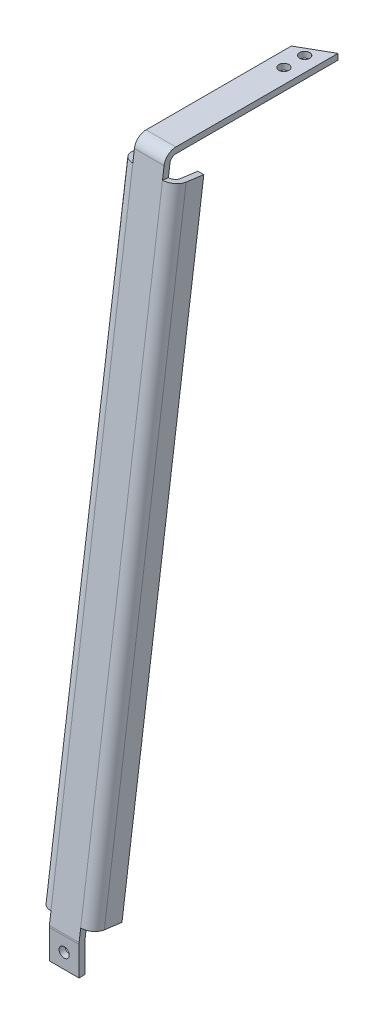
ISO-10303-21;
HEADER;
FILE_DESCRIPTION(('STEP AP214'),'2;1');
FILE_NAME('part.step','',(''),(''),'','','');
FILE_SCHEMA(('AUTOMOTIVE_DESIGN { 1 0 10303 214 1 1 1 1 }'));
ENDSEC;
DATA;
#1=APPLICATION_CONTEXT('core data for automotive mechanical design processes');
#2=APPLICATION_PROTOCOL_DEFINITION('international standard','automotive_design',2000,#1);
#3=PRODUCT_CONTEXT('',#1,'mechanical');
#4=PRODUCT('Part','Part','',(#3));
#5=PRODUCT_RELATED_PRODUCT_CATEGORY('part','',(#4));
#6=PRODUCT_DEFINITION_FORMATION('','',#4);
#7=PRODUCT_DEFINITION_CONTEXT('part definition',#1,'design');
#8=PRODUCT_DEFINITION('design','',#6,#7);
#9=PRODUCT_DEFINITION_SHAPE('','',#8);
#10=(LENGTH_UNIT() NAMED_UNIT(*) SI_UNIT(.MILLI.,.METRE.));
#11=(NAMED_UNIT(*) PLANE_ANGLE_UNIT() SI_UNIT($,.RADIAN.));
#12=(NAMED_UNIT(*) SI_UNIT($,.STERADIAN.) SOLID_ANGLE_UNIT());
#13=UNCERTAINTY_MEASURE_WITH_UNIT(LENGTH_MEASURE(1.E-05),#10,'distance_accuracy_value','');
#14=(GEOMETRIC_REPRESENTATION_CONTEXT(3) GLOBAL_UNCERTAINTY_ASSIGNED_CONTEXT((#13)) GLOBAL_UNIT_ASSIGNED_CONTEXT((#10,
#11,#12)) REPRESENTATION_CONTEXT('',''));
#15=CARTESIAN_POINT('',(0.,0.,0.));
#16=DIRECTION('',(0.,0.,1.));
#17=DIRECTION('',(1.,0.,0.));
#18=AXIS2_PLACEMENT_3D('',#15,#16,#17);
#19=CARTESIAN_POINT('',(-250.,-68.,77.3774837469467));
#20=DIRECTION('',(1.,0.,0.));
#21=DIRECTION('',(0.,0.,-1.));
#22=AXIS2_PLACEMENT_3D('',#19,#20,#21);
#23=PLANE('',#22);
#24=DIRECTION('',(0.,0.,-1.));
#25=VECTOR('',#24,1.);
#26=CARTESIAN_POINT('',(-250.,-66.,77.3774837469467));
#27=LINE('',#26,#25);
#28=CARTESIAN_POINT('',(-250.,-66.,77.3774837469467));
#29=VERTEX_POINT('',#28);
#30=CARTESIAN_POINT('',(-250.,-66.,22.8));
#31=VERTEX_POINT('',#30);
#32=EDGE_CURVE('E227',#29,#31,#27,.T.);
#33=ORIENTED_EDGE('',*,*,#32,.T.);
#34=DIRECTION('',(0.,1.,0.));
#35=VECTOR('',#34,1.);
#36=CARTESIAN_POINT('',(-250.,-68.,22.8));
#37=LINE('',#36,#35);
#38=CARTESIAN_POINT('',(-250.,-64.,22.8));
#39=VERTEX_POINT('',#38);
#40=EDGE_CURVE('E54',#31,#39,#37,.T.);
#41=ORIENTED_EDGE('',*,*,#40,.T.);
#42=DIRECTION('',(0.,0.,1.));
#43=VECTOR('',#42,1.);
#44=CARTESIAN_POINT('',(-250.,-64.,22.));
#45=LINE('',#44,#43);
#46=CARTESIAN_POINT('',(-250.,-64.,77.3774837469467));
#47=VERTEX_POINT('',#46);
#48=EDGE_CURVE('E218',#39,#47,#45,.T.);
#49=ORIENTED_EDGE('',*,*,#48,.T.);
#50=CARTESIAN_POINT('',(-250.,-68.,77.3774837469467));
#51=DIRECTION('',(1.,0.,0.));
#52=DIRECTION('',(0.,0.,-1.));
#53=AXIS2_PLACEMENT_3D('',#50,#51,#52);
#54=CIRCLE('',#53,4.00000000000001);
#55=CARTESIAN_POINT('',(-250.,-67.4653071902495,81.3415856123383));
#56=VERTEX_POINT('',#55);
#57=EDGE_CURVE('E225',#47,#56,#54,.T.);
#58=ORIENTED_EDGE('',*,*,#57,.T.);
#59=DIRECTION('',(0.,-0.991025466347899,0.133673202437623));
#60=VECTOR('',#59,1.);
#61=CARTESIAN_POINT('',(-250.,-67.4653071902495,81.3415856123383));
#62=LINE('',#61,#60);
#63=CARTESIAN_POINT('',(-250.,-71.4294090556411,81.8762784220888));
#64=VERTEX_POINT('',#63);
#65=EDGE_CURVE('E366',#56,#64,#62,.T.);
#66=ORIENTED_EDGE('',*,*,#65,.T.);
#67=DIRECTION('',(0.,-0.133673202437623,-0.991025466347899));
#68=VECTOR('',#67,1.);
#69=CARTESIAN_POINT('',(-250.,-71.9641018653916,77.9121765566972));
#70=LINE('',#69,#68);
#71=CARTESIAN_POINT('',(-250.,-71.6967554605163,79.894227489393));
#72=VERTEX_POINT('',#71);
#73=EDGE_CURVE('E265',#64,#72,#70,.T.);
#74=ORIENTED_EDGE('',*,*,#73,.T.);
#75=DIRECTION('',(0.,0.991025466347899,-0.133673202437624));
#76=VECTOR('',#75,1.);
#77=CARTESIAN_POINT('',(-250.,-279.934067195348,107.982050932696));
#78=LINE('',#77,#76);
#79=CARTESIAN_POINT('',(-250.,-67.7326535951247,79.3595346796425));
#80=VERTEX_POINT('',#79);
#81=EDGE_CURVE('E381',#72,#80,#78,.T.);
#82=ORIENTED_EDGE('',*,*,#81,.T.);
#83=CARTESIAN_POINT('',(-250.,-68.,77.3774837469467));
#84=DIRECTION('',(-1.,0.,0.));
#85=DIRECTION('',(0.,0.,-1.));
#86=AXIS2_PLACEMENT_3D('',#83,#84,#85);
#87=CIRCLE('',#86,2.);
#88=EDGE_CURVE('E384',#80,#29,#87,.T.);
#89=ORIENTED_EDGE('',*,*,#88,.T.);
#90=EDGE_LOOP('',(#33,#41,#49,#58,#66,#74,#82,#89));
#91=FACE_BOUND('',#90,.T.);
#92=ADVANCED_FACE('F41',(#91),#23,.T.);
#93=CARTESIAN_POINT('',(-260.,-68.,77.3774837469467));
#94=DIRECTION('',(1.,0.,0.));
#95=DIRECTION('',(0.,0.,-1.));
#96=AXIS2_PLACEMENT_3D('',#93,#94,#95);
#97=PLANE('',#96);
#98=DIRECTION('',(0.,1.,0.));
#99=VECTOR('',#98,1.);
#100=CARTESIAN_POINT('',(-260.,-68.,28.5));
#101=LINE('',#100,#99);
#102=CARTESIAN_POINT('',(-260.,-66.,28.5));
#103=VERTEX_POINT('',#102);
#104=CARTESIAN_POINT('',(-260.,-64.,28.5));
#105=VERTEX_POINT('',#104);
#106=EDGE_CURVE('E199',#103,#105,#101,.T.);
#107=ORIENTED_EDGE('',*,*,#106,.F.);
#108=DIRECTION('',(0.,0.,-1.));
#109=VECTOR('',#108,1.);
#110=CARTESIAN_POINT('',(-260.,-66.,77.3774837469467));
#111=LINE('',#110,#109);
#112=CARTESIAN_POINT('',(-260.,-66.,77.3774837469467));
#113=VERTEX_POINT('',#112);
#114=EDGE_CURVE('E211',#113,#103,#111,.T.);
#115=ORIENTED_EDGE('',*,*,#114,.F.);
#116=CARTESIAN_POINT('',(-260.,-68.,77.3774837469467));
#117=DIRECTION('',(-1.,0.,0.));
#118=DIRECTION('',(0.,0.,-1.));
#119=AXIS2_PLACEMENT_3D('',#116,#117,#118);
#120=CIRCLE('',#119,2.);
#121=CARTESIAN_POINT('',(-260.,-67.7326535951247,79.3595346796425));
#122=VERTEX_POINT('',#121);
#123=EDGE_CURVE('E219',#122,#113,#120,.T.);
#124=ORIENTED_EDGE('',*,*,#123,.F.);
#125=DIRECTION('',(0.,0.991025466347899,-0.133673202437624));
#126=VECTOR('',#125,1.);
#127=CARTESIAN_POINT('',(-260.,-279.934067195348,107.982050932696));
#128=LINE('',#127,#126);
#129=CARTESIAN_POINT('',(-260.,-71.6967554605164,79.894227489393));
#130=VERTEX_POINT('',#129);
#131=EDGE_CURVE('E404',#130,#122,#128,.T.);
#132=ORIENTED_EDGE('',*,*,#131,.F.);
#133=DIRECTION('',(0.,-0.133673202437623,-0.991025466347899));
#134=VECTOR('',#133,1.);
#135=CARTESIAN_POINT('',(-260.,-71.9641018653916,77.9121765566972));
#136=LINE('',#135,#134);
#137=CARTESIAN_POINT('',(-260.,-71.4294090556411,81.8762784220888));
#138=VERTEX_POINT('',#137);
#139=EDGE_CURVE('E260',#138,#130,#136,.T.);
#140=ORIENTED_EDGE('',*,*,#139,.F.);
#141=DIRECTION('',(0.,-0.991025466347899,0.133673202437623));
#142=VECTOR('',#141,1.);
#143=CARTESIAN_POINT('',(-260.,-67.4653071902495,81.3415856123383));
#144=LINE('',#143,#142);
#145=CARTESIAN_POINT('',(-260.,-67.4653071902495,81.3415856123383));
#146=VERTEX_POINT('',#145);
#147=EDGE_CURVE('E395',#146,#138,#144,.T.);
#148=ORIENTED_EDGE('',*,*,#147,.F.);
#149=CARTESIAN_POINT('',(-260.,-68.,77.3774837469467));
#150=DIRECTION('',(1.,0.,0.));
#151=DIRECTION('',(0.,0.,-1.));
#152=AXIS2_PLACEMENT_3D('',#149,#150,#151);
#153=CIRCLE('',#152,4.00000000000001);
#154=CARTESIAN_POINT('',(-260.,-64.,77.3774837469467));
#155=VERTEX_POINT('',#154);
#156=EDGE_CURVE('E386',#155,#146,#153,.T.);
#157=ORIENTED_EDGE('',*,*,#156,.F.);
#158=DIRECTION('',(0.,0.,1.));
#159=VECTOR('',#158,1.);
#160=CARTESIAN_POINT('',(-260.,-64.,22.));
#161=LINE('',#160,#159);
#162=EDGE_CURVE('E213',#105,#155,#161,.T.);
#163=ORIENTED_EDGE('',*,*,#162,.F.);
#164=EDGE_LOOP('',(#107,#115,#124,#132,#140,#148,#157,#163));
#165=FACE_BOUND('',#164,.T.);
#166=ADVANCED_FACE('F207',(#165),#97,.F.);
#167=CARTESIAN_POINT('',(-250.,-64.,22.));
#168=DIRECTION('',(0.,-1.,0.));
#169=DIRECTION('',(0.,0.,-1.));
#170=AXIS2_PLACEMENT_3D('',#167,#168,#169);
#171=PLANE('',#170);
#172=CARTESIAN_POINT('',(-255.,-64.,36.));
#173=DIRECTION('',(0.,-1.,0.));
#174=DIRECTION('',(0.,0.,-1.));
#175=AXIS2_PLACEMENT_3D('',#172,#173,#174);
#176=CIRCLE('',#175,1.69999999999998);
#177=CARTESIAN_POINT('',(-255.,-64.,34.3));
#178=VERTEX_POINT('',#177);
#179=EDGE_CURVE('E267',#178,#178,#176,.F.);
#180=ORIENTED_EDGE('',*,*,#179,.F.);
#181=EDGE_LOOP('',(#180));
#182=FACE_BOUND('',#181,.T.);
#183=CARTESIAN_POINT('',(-255.,-64.,29.));
#184=DIRECTION('',(0.,-1.,0.));
#185=DIRECTION('',(0.,0.,-1.));
#186=AXIS2_PLACEMENT_3D('',#183,#184,#185);
#187=CIRCLE('',#186,1.69999999999998);
#188=CARTESIAN_POINT('',(-255.,-64.,27.3));
#189=VERTEX_POINT('',#188);
#190=EDGE_CURVE('E272',#189,#189,#187,.F.);
#191=ORIENTED_EDGE('',*,*,#190,.F.);
#192=EDGE_LOOP('',(#191));
#193=FACE_BOUND('',#192,.T.);
#194=DIRECTION('',(0.868777270192661,0.,-0.495203044009816));
#195=VECTOR('',#194,1.);
#196=CARTESIAN_POINT('',(-249.655823080987,-64.,22.6038191561627));
#197=LINE('',#196,#195);
#198=EDGE_CURVE('E277',#105,#39,#197,.T.);
#199=ORIENTED_EDGE('',*,*,#198,.F.);
#200=ORIENTED_EDGE('',*,*,#162,.T.);
#201=DIRECTION('',(-1.,0.,0.));
#202=VECTOR('',#201,1.);
#203=CARTESIAN_POINT('',(-250.,-64.,77.3774837469467));
#204=LINE('',#203,#202);
#205=EDGE_CURVE('E255',#47,#155,#204,.T.);
#206=ORIENTED_EDGE('',*,*,#205,.F.);
#207=ORIENTED_EDGE('',*,*,#48,.F.);
#208=EDGE_LOOP('',(#199,#200,#206,#207));
#209=FACE_BOUND('',#208,.T.);
#210=ADVANCED_FACE('F43',(#182,#193,#209),#171,.F.);
#211=CARTESIAN_POINT('',(-250.,-66.,77.3774837469467));
#212=DIRECTION('',(0.,1.,0.));
#213=DIRECTION('',(0.,0.,1.));
#214=AXIS2_PLACEMENT_3D('',#211,#212,#213);
#215=PLANE('',#214);
#216=CARTESIAN_POINT('',(-255.,-66.,36.));
#217=DIRECTION('',(0.,1.,0.));
#218=DIRECTION('',(0.,0.,1.));
#219=AXIS2_PLACEMENT_3D('',#216,#217,#218);
#220=CIRCLE('',#219,1.69999999999998);
#221=CARTESIAN_POINT('',(-255.,-66.,37.7));
#222=VERTEX_POINT('',#221);
#223=EDGE_CURVE('E266',#222,#222,#220,.F.);
#224=ORIENTED_EDGE('',*,*,#223,.F.);
#225=EDGE_LOOP('',(#224));
#226=FACE_BOUND('',#225,.T.);
#227=CARTESIAN_POINT('',(-255.,-66.,29.));
#228=DIRECTION('',(0.,1.,0.));
#229=DIRECTION('',(0.,0.,1.));
#230=AXIS2_PLACEMENT_3D('',#227,#228,#229);
#231=CIRCLE('',#230,1.69999999999998);
#232=CARTESIAN_POINT('',(-255.,-66.,30.7));
#233=VERTEX_POINT('',#232);
#234=EDGE_CURVE('E271',#233,#233,#231,.F.);
#235=ORIENTED_EDGE('',*,*,#234,.F.);
#236=EDGE_LOOP('',(#235));
#237=FACE_BOUND('',#236,.T.);
#238=DIRECTION('',(-0.868777270192661,0.,0.495203044009816));
#239=VECTOR('',#238,1.);
#240=CARTESIAN_POINT('',(-273.480387754366,-66.,36.1838210199886));
#241=LINE('',#240,#239);
#242=EDGE_CURVE('E11',#31,#103,#241,.T.);
#243=ORIENTED_EDGE('',*,*,#242,.F.);
#244=ORIENTED_EDGE('',*,*,#32,.F.);
#245=DIRECTION('',(-1.,0.,0.));
#246=VECTOR('',#245,1.);
#247=CARTESIAN_POINT('',(-250.,-66.,77.3774837469467));
#248=LINE('',#247,#246);
#249=EDGE_CURVE('E217',#29,#113,#248,.T.);
#250=ORIENTED_EDGE('',*,*,#249,.T.);
#251=ORIENTED_EDGE('',*,*,#114,.T.);
#252=EDGE_LOOP('',(#243,#244,#250,#251));
#253=FACE_BOUND('',#252,.T.);
#254=ADVANCED_FACE('F216',(#226,#237,#253),#215,.F.);
#255=CARTESIAN_POINT('',(-250.,-68.,77.3774837469467));
#256=DIRECTION('',(-1.,0.,0.));
#257=DIRECTION('',(0.,0.,1.));
#258=AXIS2_PLACEMENT_3D('',#255,#256,#257);
#259=CYLINDRICAL_SURFACE('',#258,4.00000000000001);
#260=ORIENTED_EDGE('',*,*,#156,.T.);
#261=DIRECTION('',(-1.,0.,0.));
#262=VECTOR('',#261,1.);
#263=CARTESIAN_POINT('',(-250.,-67.4653071902495,81.3415856123383));
#264=LINE('',#263,#262);
#265=EDGE_CURVE('E253',#56,#146,#264,.T.);
#266=ORIENTED_EDGE('',*,*,#265,.F.);
#267=ORIENTED_EDGE('',*,*,#57,.F.);
#268=ORIENTED_EDGE('',*,*,#205,.T.);
#269=EDGE_LOOP('',(#260,#266,#267,#268));
#270=FACE_BOUND('',#269,.T.);
#271=ADVANCED_FACE('F473',(#270),#259,.T.);
#272=CARTESIAN_POINT('',(-250.,-67.4653071902495,81.3415856123383));
#273=DIRECTION('',(0.,-0.133673202437623,-0.991025466347899));
#274=DIRECTION('',(0.,0.991025466347899,-0.133673202437623));
#275=AXIS2_PLACEMENT_3D('',#272,#273,#274);
#276=PLANE('',#275);
#277=ORIENTED_EDGE('',*,*,#147,.T.);
#278=DIRECTION('',(0.,0.991025466347899,-0.133673202437623));
#279=VECTOR('',#278,1.);
#280=CARTESIAN_POINT('',(-260.,-275.702618925081,109.429409055641));
#281=LINE('',#280,#279);
#282=CARTESIAN_POINT('',(-260.,-275.702618925081,109.429409055641));
#283=VERTEX_POINT('',#282);
#284=EDGE_CURVE('E304',#283,#138,#281,.T.);
#285=ORIENTED_EDGE('',*,*,#284,.F.);
#286=CARTESIAN_POINT('',(-260.,-279.666720790473,109.964101865392));
#287=VERTEX_POINT('',#286);
#288=EDGE_CURVE('E393',#283,#287,#144,.T.);
#289=ORIENTED_EDGE('',*,*,#288,.T.);
#290=DIRECTION('',(-1.,0.,0.));
#291=VECTOR('',#290,1.);
#292=CARTESIAN_POINT('',(-250.,-279.666720790473,109.964101865392));
#293=LINE('',#292,#291);
#294=CARTESIAN_POINT('',(-250.,-279.666720790473,109.964101865392));
#295=VERTEX_POINT('',#294);
#296=EDGE_CURVE('E250',#295,#287,#293,.T.);
#297=ORIENTED_EDGE('',*,*,#296,.F.);
#298=CARTESIAN_POINT('',(-250.,-275.702618925081,109.429409055641));
#299=VERTEX_POINT('',#298);
#300=EDGE_CURVE('E370',#299,#295,#62,.T.);
#301=ORIENTED_EDGE('',*,*,#300,.F.);
#302=DIRECTION('',(0.,0.991025466347899,-0.133673202437623));
#303=VECTOR('',#302,1.);
#304=CARTESIAN_POINT('',(-250.,-275.702618925081,109.429409055641));
#305=LINE('',#304,#303);
#306=EDGE_CURVE('E290',#299,#64,#305,.T.);
#307=ORIENTED_EDGE('',*,*,#306,.T.);
#308=ORIENTED_EDGE('',*,*,#65,.F.);
#309=ORIENTED_EDGE('',*,*,#265,.T.);
#310=EDGE_LOOP('',(#277,#285,#289,#297,#301,#307,#308,#309));
#311=FACE_BOUND('',#310,.T.);
#312=ADVANCED_FACE('F467',(#311),#276,.F.);
#313=CARTESIAN_POINT('',(-250.,-280.201413600223,106.));
#314=DIRECTION('',(-1.,0.,0.));
#315=DIRECTION('',(0.,0.,1.));
#316=AXIS2_PLACEMENT_3D('',#313,#314,#315);
#317=CYLINDRICAL_SURFACE('',#316,3.99999999999999);
#318=CARTESIAN_POINT('',(-260.,-280.201413600223,106.));
#319=DIRECTION('',(1.,0.,0.));
#320=DIRECTION('',(0.,0.,-1.));
#321=AXIS2_PLACEMENT_3D('',#318,#319,#320);
#322=CIRCLE('',#321,3.99999999999999);
#323=CARTESIAN_POINT('',(-260.,-280.201413600223,110.));
#324=VERTEX_POINT('',#323);
#325=EDGE_CURVE('E392',#287,#324,#322,.T.);
#326=ORIENTED_EDGE('',*,*,#325,.T.);
#327=DIRECTION('',(-1.,0.,0.));
#328=VECTOR('',#327,1.);
#329=CARTESIAN_POINT('',(-250.,-280.201413600223,110.));
#330=LINE('',#329,#328);
#331=CARTESIAN_POINT('',(-250.,-280.201413600223,110.));
#332=VERTEX_POINT('',#331);
#333=EDGE_CURVE('E242',#332,#324,#330,.T.);
#334=ORIENTED_EDGE('',*,*,#333,.F.);
#335=CARTESIAN_POINT('',(-250.,-280.201413600223,106.));
#336=DIRECTION('',(1.,0.,0.));
#337=DIRECTION('',(0.,0.,-1.));
#338=AXIS2_PLACEMENT_3D('',#335,#336,#337);
#339=CIRCLE('',#338,3.99999999999999);
#340=EDGE_CURVE('E371',#295,#332,#339,.T.);
#341=ORIENTED_EDGE('',*,*,#340,.F.);
#342=ORIENTED_EDGE('',*,*,#296,.T.);
#343=EDGE_LOOP('',(#326,#334,#341,#342));
#344=FACE_BOUND('',#343,.T.);
#345=ADVANCED_FACE('F520',(#344),#317,.T.);
#346=CARTESIAN_POINT('',(-250.,-280.201413600223,110.));
#347=DIRECTION('',(0.,0.,-1.));
#348=DIRECTION('',(0.,1.,0.));
#349=AXIS2_PLACEMENT_3D('',#346,#347,#348);
#350=PLANE('',#349);
#351=CARTESIAN_POINT('',(-255.,-285.,110.));
#352=DIRECTION('',(0.,0.,-1.));
#353=DIRECTION('',(0.,1.,0.));
#354=AXIS2_PLACEMENT_3D('',#351,#352,#353);
#355=CIRCLE('',#354,1.69999999999998);
#356=CARTESIAN_POINT('',(-255.,-283.3,110.));
#357=VERTEX_POINT('',#356);
#358=EDGE_CURVE('E269',#357,#357,#355,.F.);
#359=ORIENTED_EDGE('',*,*,#358,.F.);
#360=EDGE_LOOP('',(#359));
#361=FACE_BOUND('',#360,.T.);
#362=DIRECTION('',(0.,-1.,0.));
#363=VECTOR('',#362,1.);
#364=CARTESIAN_POINT('',(-260.,-280.201413600223,110.));
#365=LINE('',#364,#363);
#366=CARTESIAN_POINT('',(-260.,-290.,110.));
#367=VERTEX_POINT('',#366);
#368=EDGE_CURVE('E399',#324,#367,#365,.T.);
#369=ORIENTED_EDGE('',*,*,#368,.T.);
#370=DIRECTION('',(-1.,0.,0.));
#371=VECTOR('',#370,1.);
#372=CARTESIAN_POINT('',(-250.,-290.,110.));
#373=LINE('',#372,#371);
#374=CARTESIAN_POINT('',(-250.,-290.,110.));
#375=VERTEX_POINT('',#374);
#376=EDGE_CURVE('E245',#375,#367,#373,.T.);
#377=ORIENTED_EDGE('',*,*,#376,.F.);
#378=DIRECTION('',(0.,-1.,0.));
#379=VECTOR('',#378,1.);
#380=CARTESIAN_POINT('',(-250.,-280.201413600223,110.));
#381=LINE('',#380,#379);
#382=EDGE_CURVE('E373',#332,#375,#381,.T.);
#383=ORIENTED_EDGE('',*,*,#382,.F.);
#384=ORIENTED_EDGE('',*,*,#333,.T.);
#385=EDGE_LOOP('',(#369,#377,#383,#384));
#386=FACE_BOUND('',#385,.T.);
#387=ADVANCED_FACE('F511',(#361,#386),#350,.F.);
#388=CARTESIAN_POINT('',(-250.,-290.,110.));
#389=DIRECTION('',(0.,1.,0.));
#390=DIRECTION('',(0.,0.,1.));
#391=AXIS2_PLACEMENT_3D('',#388,#389,#390);
#392=PLANE('',#391);
#393=DIRECTION('',(0.,0.,-1.));
#394=VECTOR('',#393,1.);
#395=CARTESIAN_POINT('',(-260.,-290.,110.));
#396=LINE('',#395,#394);
#397=CARTESIAN_POINT('',(-260.,-290.,108.));
#398=VERTEX_POINT('',#397);
#399=EDGE_CURVE('E396',#367,#398,#396,.T.);
#400=ORIENTED_EDGE('',*,*,#399,.T.);
#401=DIRECTION('',(-1.,0.,0.));
#402=VECTOR('',#401,1.);
#403=CARTESIAN_POINT('',(-250.,-290.,108.));
#404=LINE('',#403,#402);
#405=CARTESIAN_POINT('',(-250.,-290.,108.));
#406=VERTEX_POINT('',#405);
#407=EDGE_CURVE('E239',#406,#398,#404,.T.);
#408=ORIENTED_EDGE('',*,*,#407,.F.);
#409=DIRECTION('',(0.,0.,-1.));
#410=VECTOR('',#409,1.);
#411=CARTESIAN_POINT('',(-250.,-290.,110.));
#412=LINE('',#411,#410);
#413=EDGE_CURVE('E374',#375,#406,#412,.T.);
#414=ORIENTED_EDGE('',*,*,#413,.F.);
#415=ORIENTED_EDGE('',*,*,#376,.T.);
#416=EDGE_LOOP('',(#400,#408,#414,#415));
#417=FACE_BOUND('',#416,.T.);
#418=ADVANCED_FACE('F506',(#417),#392,.F.);
#419=CARTESIAN_POINT('',(-250.,-290.,108.));
#420=DIRECTION('',(0.,0.,1.));
#421=DIRECTION('',(1.,0.,0.));
#422=AXIS2_PLACEMENT_3D('',#419,#420,#421);
#423=PLANE('',#422);
#424=CARTESIAN_POINT('',(-255.,-285.,108.));
#425=DIRECTION('',(0.,0.,1.));
#426=DIRECTION('',(1.,0.,0.));
#427=AXIS2_PLACEMENT_3D('',#424,#425,#426);
#428=CIRCLE('',#427,1.69999999999998);
#429=CARTESIAN_POINT('',(-253.3,-285.,108.));
#430=VERTEX_POINT('',#429);
#431=EDGE_CURVE('E273',#430,#430,#428,.F.);
#432=ORIENTED_EDGE('',*,*,#431,.F.);
#433=EDGE_LOOP('',(#432));
#434=FACE_BOUND('',#433,.T.);
#435=DIRECTION('',(0.,1.,0.));
#436=VECTOR('',#435,1.);
#437=CARTESIAN_POINT('',(-260.,-290.,108.));
#438=LINE('',#437,#436);
#439=CARTESIAN_POINT('',(-260.,-280.201413600223,108.));
#440=VERTEX_POINT('',#439);
#441=EDGE_CURVE('E402',#398,#440,#438,.T.);
#442=ORIENTED_EDGE('',*,*,#441,.T.);
#443=DIRECTION('',(-1.,0.,0.));
#444=VECTOR('',#443,1.);
#445=CARTESIAN_POINT('',(-250.,-280.201413600223,108.));
#446=LINE('',#445,#444);
#447=CARTESIAN_POINT('',(-250.,-280.201413600223,108.));
#448=VERTEX_POINT('',#447);
#449=EDGE_CURVE('E237',#448,#440,#446,.T.);
#450=ORIENTED_EDGE('',*,*,#449,.F.);
#451=DIRECTION('',(0.,1.,0.));
#452=VECTOR('',#451,1.);
#453=CARTESIAN_POINT('',(-250.,-290.,108.));
#454=LINE('',#453,#452);
#455=EDGE_CURVE('E380',#406,#448,#454,.T.);
#456=ORIENTED_EDGE('',*,*,#455,.F.);
#457=ORIENTED_EDGE('',*,*,#407,.T.);
#458=EDGE_LOOP('',(#442,#450,#456,#457));
#459=FACE_BOUND('',#458,.T.);
#460=ADVANCED_FACE('F507',(#434,#459),#423,.F.);
#461=CARTESIAN_POINT('',(-250.,-280.201413600223,106.));
#462=DIRECTION('',(-1.,0.,0.));
#463=DIRECTION('',(0.,0.,1.));
#464=AXIS2_PLACEMENT_3D('',#461,#462,#463);
#465=CYLINDRICAL_SURFACE('',#464,2.00000000000001);
#466=CARTESIAN_POINT('',(-260.,-280.201413600223,106.));
#467=DIRECTION('',(-1.,0.,0.));
#468=DIRECTION('',(0.,0.,-1.));
#469=AXIS2_PLACEMENT_3D('',#466,#467,#468);
#470=CIRCLE('',#469,2.00000000000001);
#471=CARTESIAN_POINT('',(-260.,-279.934067195348,107.982050932696));
#472=VERTEX_POINT('',#471);
#473=EDGE_CURVE('E401',#440,#472,#470,.T.);
#474=ORIENTED_EDGE('',*,*,#473,.T.);
#475=DIRECTION('',(-1.,0.,0.));
#476=VECTOR('',#475,1.);
#477=CARTESIAN_POINT('',(-250.,-279.934067195348,107.982050932696));
#478=LINE('',#477,#476);
#479=CARTESIAN_POINT('',(-250.,-279.934067195348,107.982050932696));
#480=VERTEX_POINT('',#479);
#481=EDGE_CURVE('E235',#480,#472,#478,.T.);
#482=ORIENTED_EDGE('',*,*,#481,.F.);
#483=CARTESIAN_POINT('',(-250.,-280.201413600223,106.));
#484=DIRECTION('',(-1.,0.,0.));
#485=DIRECTION('',(0.,0.,-1.));
#486=AXIS2_PLACEMENT_3D('',#483,#484,#485);
#487=CIRCLE('',#486,2.00000000000001);
#488=EDGE_CURVE('E377',#448,#480,#487,.T.);
#489=ORIENTED_EDGE('',*,*,#488,.F.);
#490=ORIENTED_EDGE('',*,*,#449,.T.);
#491=EDGE_LOOP('',(#474,#482,#489,#490));
#492=FACE_BOUND('',#491,.T.);
#493=ADVANCED_FACE('F429',(#492),#465,.F.);
#494=CARTESIAN_POINT('',(-250.,-279.934067195348,107.982050932696));
#495=DIRECTION('',(0.,0.133673202437624,0.991025466347899));
#496=DIRECTION('',(0.,-0.991025466347899,0.133673202437624));
#497=AXIS2_PLACEMENT_3D('',#494,#495,#496);
#498=PLANE('',#497);
#499=DIRECTION('',(0.,0.991025466347899,-0.133673202437623));
#500=VECTOR('',#499,1.);
#501=CARTESIAN_POINT('',(-250.,-275.969965329956,107.447358122945));
#502=LINE('',#501,#500);
#503=CARTESIAN_POINT('',(-250.,-275.969965329956,107.447358122945));
#504=VERTEX_POINT('',#503);
#505=EDGE_CURVE('E334',#504,#72,#502,.T.);
#506=ORIENTED_EDGE('',*,*,#505,.F.);
#507=EDGE_CURVE('E385',#480,#504,#78,.T.);
#508=ORIENTED_EDGE('',*,*,#507,.F.);
#509=ORIENTED_EDGE('',*,*,#481,.T.);
#510=CARTESIAN_POINT('',(-260.,-275.969965329956,107.447358122945));
#511=VERTEX_POINT('',#510);
#512=EDGE_CURVE('E221',#472,#511,#128,.T.);
#513=ORIENTED_EDGE('',*,*,#512,.T.);
#514=DIRECTION('',(0.,0.991025466347899,-0.133673202437623));
#515=VECTOR('',#514,1.);
#516=CARTESIAN_POINT('',(-260.,-275.969965329956,107.447358122945));
#517=LINE('',#516,#515);
#518=EDGE_CURVE('E320',#511,#130,#517,.T.);
#519=ORIENTED_EDGE('',*,*,#518,.T.);
#520=ORIENTED_EDGE('',*,*,#131,.T.);
#521=DIRECTION('',(-1.,0.,0.));
#522=VECTOR('',#521,1.);
#523=CARTESIAN_POINT('',(-250.,-67.7326535951247,79.3595346796425));
#524=LINE('',#523,#522);
#525=EDGE_CURVE('E229',#80,#122,#524,.T.);
#526=ORIENTED_EDGE('',*,*,#525,.F.);
#527=ORIENTED_EDGE('',*,*,#81,.F.);
#528=EDGE_LOOP('',(#506,#508,#509,#513,#519,#520,#526,#527));
#529=FACE_BOUND('',#528,.T.);
#530=ADVANCED_FACE('F412',(#529),#498,.F.);
#531=CARTESIAN_POINT('',(-250.,-68.,77.3774837469467));
#532=DIRECTION('',(-1.,0.,0.));
#533=DIRECTION('',(0.,0.,1.));
#534=AXIS2_PLACEMENT_3D('',#531,#532,#533);
#535=CYLINDRICAL_SURFACE('',#534,2.);
#536=ORIENTED_EDGE('',*,*,#123,.T.);
#537=ORIENTED_EDGE('',*,*,#249,.F.);
#538=ORIENTED_EDGE('',*,*,#88,.F.);
#539=ORIENTED_EDGE('',*,*,#525,.T.);
#540=EDGE_LOOP('',(#536,#537,#538,#539));
#541=FACE_BOUND('',#540,.T.);
#542=ADVANCED_FACE('F418',(#541),#535,.F.);
#543=DIRECTION('',(0.,-0.133673202437623,-0.991025466347899));
#544=VECTOR('',#543,1.);
#545=CARTESIAN_POINT('',(-250.,-276.237311734832,105.465307190249));
#546=LINE('',#545,#544);
#547=EDGE_CURVE('E47',#299,#504,#546,.T.);
#548=ORIENTED_EDGE('',*,*,#547,.F.);
#549=ORIENTED_EDGE('',*,*,#300,.T.);
#550=ORIENTED_EDGE('',*,*,#340,.T.);
#551=ORIENTED_EDGE('',*,*,#382,.T.);
#552=ORIENTED_EDGE('',*,*,#413,.T.);
#553=ORIENTED_EDGE('',*,*,#455,.T.);
#554=ORIENTED_EDGE('',*,*,#488,.T.);
#555=ORIENTED_EDGE('',*,*,#507,.T.);
#556=EDGE_LOOP('',(#548,#549,#550,#551,#552,#553,#554,#555));
#557=FACE_BOUND('',#556,.T.);
#558=ADVANCED_FACE('F421',(#557),#23,.T.);
#559=ORIENTED_EDGE('',*,*,#288,.F.);
#560=DIRECTION('',(0.,-0.133673202437623,-0.991025466347899));
#561=VECTOR('',#560,1.);
#562=CARTESIAN_POINT('',(-260.,-276.237311734832,105.465307190249));
#563=LINE('',#562,#561);
#564=EDGE_CURVE('E257',#283,#511,#563,.T.);
#565=ORIENTED_EDGE('',*,*,#564,.T.);
#566=ORIENTED_EDGE('',*,*,#512,.F.);
#567=ORIENTED_EDGE('',*,*,#473,.F.);
#568=ORIENTED_EDGE('',*,*,#441,.F.);
#569=ORIENTED_EDGE('',*,*,#399,.F.);
#570=ORIENTED_EDGE('',*,*,#368,.F.);
#571=ORIENTED_EDGE('',*,*,#325,.F.);
#572=EDGE_LOOP('',(#559,#565,#566,#567,#568,#569,#570,#571));
#573=FACE_BOUND('',#572,.T.);
#574=ADVANCED_FACE('F433',(#573),#97,.F.);
#575=CARTESIAN_POINT('',(-260.,-276.237311734832,105.465307190249));
#576=DIRECTION('',(0.,-0.991025466347899,0.133673202437623));
#577=DIRECTION('',(0.,-0.133673202437623,-0.991025466347899));
#578=AXIS2_PLACEMENT_3D('',#575,#576,#577);
#579=PLANE('',#578);
#580=ORIENTED_EDGE('',*,*,#564,.F.);
#581=CARTESIAN_POINT('',(-260.,-276.237311734832,105.465307190249));
#582=DIRECTION('',(0.,-0.991025466347899,0.133673202437623));
#583=DIRECTION('',(0.,-0.133673202437623,-0.991025466347899));
#584=AXIS2_PLACEMENT_3D('',#581,#582,#583);
#585=CIRCLE('',#584,4.00000000000001);
#586=CARTESIAN_POINT('',(-264.,-276.237311734832,105.465307190249));
#587=VERTEX_POINT('',#586);
#588=EDGE_CURVE('E286',#283,#587,#585,.T.);
#589=ORIENTED_EDGE('',*,*,#588,.T.);
#590=DIRECTION('',(0.,-0.133673202437623,-0.991025466347899));
#591=VECTOR('',#590,1.);
#592=CARTESIAN_POINT('',(-264.,-276.237311734832,105.465307190249));
#593=LINE('',#592,#591);
#594=CARTESIAN_POINT('',(-264.,-277.039350949457,99.519154392162));
#595=VERTEX_POINT('',#594);
#596=EDGE_CURVE('E295',#587,#595,#593,.T.);
#597=ORIENTED_EDGE('',*,*,#596,.T.);
#598=DIRECTION('',(1.,0.,0.));
#599=VECTOR('',#598,1.);
#600=CARTESIAN_POINT('',(-264.,-277.039350949457,99.519154392162));
#601=LINE('',#600,#599);
#602=CARTESIAN_POINT('',(-262.,-277.039350949457,99.519154392162));
#603=VERTEX_POINT('',#602);
#604=EDGE_CURVE('E293',#595,#603,#601,.T.);
#605=ORIENTED_EDGE('',*,*,#604,.T.);
#606=DIRECTION('',(0.,0.133673202437623,0.991025466347899));
#607=VECTOR('',#606,1.);
#608=CARTESIAN_POINT('',(-262.,-277.039350949457,99.519154392162));
#609=LINE('',#608,#607);
#610=CARTESIAN_POINT('',(-262.,-276.237311734832,105.465307190249));
#611=VERTEX_POINT('',#610);
#612=EDGE_CURVE('E300',#603,#611,#609,.T.);
#613=ORIENTED_EDGE('',*,*,#612,.T.);
#614=CARTESIAN_POINT('',(-260.,-276.237311734832,105.465307190249));
#615=DIRECTION('',(0.,0.991025466347899,-0.133673202437623));
#616=DIRECTION('',(0.,-0.133673202437623,-0.991025466347899));
#617=AXIS2_PLACEMENT_3D('',#614,#615,#616);
#618=CIRCLE('',#617,2.00000000000001);
#619=EDGE_CURVE('E299',#611,#511,#618,.T.);
#620=ORIENTED_EDGE('',*,*,#619,.T.);
#621=EDGE_LOOP('',(#580,#589,#597,#605,#613,#620));
#622=FACE_BOUND('',#621,.T.);
#623=ADVANCED_FACE('F439',(#622),#579,.T.);
#624=CARTESIAN_POINT('',(-260.,-71.9641018653916,77.9121765566972));
#625=DIRECTION('',(0.,-0.991025466347899,0.133673202437623));
#626=DIRECTION('',(0.,-0.133673202437623,-0.991025466347899));
#627=AXIS2_PLACEMENT_3D('',#624,#625,#626);
#628=PLANE('',#627);
#629=CARTESIAN_POINT('',(-260.,-71.9641018653916,77.9121765566972));
#630=DIRECTION('',(0.,-0.991025466347899,0.133673202437623));
#631=DIRECTION('',(0.,-0.133673202437623,-0.991025466347899));
#632=AXIS2_PLACEMENT_3D('',#629,#630,#631);
#633=CIRCLE('',#632,4.00000000000001);
#634=CARTESIAN_POINT('',(-264.,-71.9641018653916,77.9121765566972));
#635=VERTEX_POINT('',#634);
#636=EDGE_CURVE('E305',#138,#635,#633,.T.);
#637=ORIENTED_EDGE('',*,*,#636,.F.);
#638=ORIENTED_EDGE('',*,*,#139,.T.);
#639=CARTESIAN_POINT('',(-260.,-71.9641018653916,77.9121765566972));
#640=DIRECTION('',(0.,0.991025466347899,-0.133673202437623));
#641=DIRECTION('',(0.,-0.133673202437623,-0.991025466347899));
#642=AXIS2_PLACEMENT_3D('',#639,#640,#641);
#643=CIRCLE('',#642,2.00000000000001);
#644=CARTESIAN_POINT('',(-262.,-71.9641018653916,77.9121765566972));
#645=VERTEX_POINT('',#644);
#646=EDGE_CURVE('E291',#645,#130,#643,.T.);
#647=ORIENTED_EDGE('',*,*,#646,.F.);
#648=DIRECTION('',(0.,0.133673202437623,0.991025466347899));
#649=VECTOR('',#648,1.);
#650=CARTESIAN_POINT('',(-262.,-72.7661410800173,71.9660237586098));
#651=LINE('',#650,#649);
#652=CARTESIAN_POINT('',(-262.,-72.7661410800173,71.9660237586098));
#653=VERTEX_POINT('',#652);
#654=EDGE_CURVE('E313',#653,#645,#651,.T.);
#655=ORIENTED_EDGE('',*,*,#654,.F.);
#656=DIRECTION('',(1.,0.,0.));
#657=VECTOR('',#656,1.);
#658=CARTESIAN_POINT('',(-264.,-72.7661410800173,71.9660237586098));
#659=LINE('',#658,#657);
#660=CARTESIAN_POINT('',(-264.,-72.7661410800173,71.9660237586098));
#661=VERTEX_POINT('',#660);
#662=EDGE_CURVE('E310',#661,#653,#659,.T.);
#663=ORIENTED_EDGE('',*,*,#662,.F.);
#664=DIRECTION('',(0.,-0.133673202437623,-0.991025466347899));
#665=VECTOR('',#664,1.);
#666=CARTESIAN_POINT('',(-264.,-71.9641018653916,77.9121765566972));
#667=LINE('',#666,#665);
#668=EDGE_CURVE('E308',#635,#661,#667,.T.);
#669=ORIENTED_EDGE('',*,*,#668,.F.);
#670=EDGE_LOOP('',(#637,#638,#647,#655,#663,#669));
#671=FACE_BOUND('',#670,.T.);
#672=ADVANCED_FACE('F461',(#671),#628,.F.);
#673=CARTESIAN_POINT('',(-260.,-276.237311734832,105.465307190249));
#674=DIRECTION('',(0.,0.991025466347899,-0.133673202437623));
#675=DIRECTION('',(0.,0.133673202437623,0.991025466347899));
#676=AXIS2_PLACEMENT_3D('',#673,#674,#675);
#677=CYLINDRICAL_SURFACE('',#676,4.00000000000001);
#678=ORIENTED_EDGE('',*,*,#636,.T.);
#679=DIRECTION('',(0.,0.991025466347899,-0.133673202437623));
#680=VECTOR('',#679,1.);
#681=CARTESIAN_POINT('',(-264.,-276.237311734832,105.465307190249));
#682=LINE('',#681,#680);
#683=EDGE_CURVE('E327',#587,#635,#682,.T.);
#684=ORIENTED_EDGE('',*,*,#683,.F.);
#685=ORIENTED_EDGE('',*,*,#588,.F.);
#686=ORIENTED_EDGE('',*,*,#284,.T.);
#687=EDGE_LOOP('',(#678,#684,#685,#686));
#688=FACE_BOUND('',#687,.T.);
#689=ADVANCED_FACE('F441',(#688),#677,.T.);
#690=CARTESIAN_POINT('',(-264.,-276.237311734832,105.465307190249));
#691=DIRECTION('',(1.,0.,0.));
#692=DIRECTION('',(0.,0.,-1.));
#693=AXIS2_PLACEMENT_3D('',#690,#691,#692);
#694=PLANE('',#693);
#695=ORIENTED_EDGE('',*,*,#668,.T.);
#696=DIRECTION('',(0.,0.991025466347899,-0.133673202437623));
#697=VECTOR('',#696,1.);
#698=CARTESIAN_POINT('',(-264.,-277.039350949457,99.519154392162));
#699=LINE('',#698,#697);
#700=EDGE_CURVE('E324',#595,#661,#699,.T.);
#701=ORIENTED_EDGE('',*,*,#700,.F.);
#702=ORIENTED_EDGE('',*,*,#596,.F.);
#703=ORIENTED_EDGE('',*,*,#683,.T.);
#704=EDGE_LOOP('',(#695,#701,#702,#703));
#705=FACE_BOUND('',#704,.T.);
#706=ADVANCED_FACE('F450',(#705),#694,.F.);
#707=CARTESIAN_POINT('',(-264.,-277.039350949457,99.519154392162));
#708=DIRECTION('',(0.,0.133673202437623,0.991025466347899));
#709=DIRECTION('',(0.,-0.991025466347899,0.133673202437623));
#710=AXIS2_PLACEMENT_3D('',#707,#708,#709);
#711=PLANE('',#710);
#712=ORIENTED_EDGE('',*,*,#662,.T.);
#713=DIRECTION('',(0.,0.991025466347899,-0.133673202437623));
#714=VECTOR('',#713,1.);
#715=CARTESIAN_POINT('',(-262.,-277.039350949457,99.519154392162));
#716=LINE('',#715,#714);
#717=EDGE_CURVE('E325',#603,#653,#716,.T.);
#718=ORIENTED_EDGE('',*,*,#717,.F.);
#719=ORIENTED_EDGE('',*,*,#604,.F.);
#720=ORIENTED_EDGE('',*,*,#700,.T.);
#721=EDGE_LOOP('',(#712,#718,#719,#720));
#722=FACE_BOUND('',#721,.T.);
#723=ADVANCED_FACE('F451',(#722),#711,.F.);
#724=CARTESIAN_POINT('',(-262.,-277.039350949457,99.519154392162));
#725=DIRECTION('',(-1.,0.,0.));
#726=DIRECTION('',(0.,0.,1.));
#727=AXIS2_PLACEMENT_3D('',#724,#725,#726);
#728=PLANE('',#727);
#729=ORIENTED_EDGE('',*,*,#654,.T.);
#730=DIRECTION('',(0.,0.991025466347899,-0.133673202437623));
#731=VECTOR('',#730,1.);
#732=CARTESIAN_POINT('',(-262.,-276.237311734832,105.465307190249));
#733=LINE('',#732,#731);
#734=EDGE_CURVE('E317',#611,#645,#733,.T.);
#735=ORIENTED_EDGE('',*,*,#734,.F.);
#736=ORIENTED_EDGE('',*,*,#612,.F.);
#737=ORIENTED_EDGE('',*,*,#717,.T.);
#738=EDGE_LOOP('',(#729,#735,#736,#737));
#739=FACE_BOUND('',#738,.T.);
#740=ADVANCED_FACE('F456',(#739),#728,.F.);
#741=CARTESIAN_POINT('',(-260.,-276.237311734832,105.465307190249));
#742=DIRECTION('',(0.,0.991025466347899,-0.133673202437623));
#743=DIRECTION('',(0.,0.133673202437623,0.991025466347899));
#744=AXIS2_PLACEMENT_3D('',#741,#742,#743);
#745=CYLINDRICAL_SURFACE('',#744,2.00000000000001);
#746=ORIENTED_EDGE('',*,*,#646,.T.);
#747=ORIENTED_EDGE('',*,*,#518,.F.);
#748=ORIENTED_EDGE('',*,*,#619,.F.);
#749=ORIENTED_EDGE('',*,*,#734,.T.);
#750=EDGE_LOOP('',(#746,#747,#748,#749));
#751=FACE_BOUND('',#750,.T.);
#752=ADVANCED_FACE('F463',(#751),#745,.F.);
#753=CARTESIAN_POINT('',(-250.,-276.237311734832,105.465307190249));
#754=DIRECTION('',(0.,0.991025466347899,-0.133673202437623));
#755=DIRECTION('',(0.,0.133673202437623,0.991025466347899));
#756=AXIS2_PLACEMENT_3D('',#753,#754,#755);
#757=CYLINDRICAL_SURFACE('',#756,4.00000000000001);
#758=CARTESIAN_POINT('',(-250.,-71.9641018653916,77.9121765566972));
#759=DIRECTION('',(0.,-0.991025466347899,0.133673202437623));
#760=DIRECTION('',(0.,-0.133673202437623,-0.991025466347899));
#761=AXIS2_PLACEMENT_3D('',#758,#759,#760);
#762=CIRCLE('',#761,4.00000000000001);
#763=CARTESIAN_POINT('',(-246.,-71.9641018653916,77.9121765566972));
#764=VERTEX_POINT('',#763);
#765=EDGE_CURVE('E307',#764,#64,#762,.T.);
#766=ORIENTED_EDGE('',*,*,#765,.T.);
#767=ORIENTED_EDGE('',*,*,#306,.F.);
#768=CARTESIAN_POINT('',(-250.,-276.237311734832,105.465307190249));
#769=DIRECTION('',(0.,-0.991025466347899,0.133673202437623));
#770=DIRECTION('',(0.,-0.133673202437623,-0.991025466347899));
#771=AXIS2_PLACEMENT_3D('',#768,#769,#770);
#772=CIRCLE('',#771,4.00000000000001);
#773=CARTESIAN_POINT('',(-246.,-276.237311734832,105.465307190249));
#774=VERTEX_POINT('',#773);
#775=EDGE_CURVE('E353',#774,#299,#772,.T.);
#776=ORIENTED_EDGE('',*,*,#775,.F.);
#777=DIRECTION('',(0.,0.991025466347899,-0.133673202437623));
#778=VECTOR('',#777,1.);
#779=CARTESIAN_POINT('',(-246.,-276.237311734832,105.465307190249));
#780=LINE('',#779,#778);
#781=EDGE_CURVE('E341',#774,#764,#780,.T.);
#782=ORIENTED_EDGE('',*,*,#781,.T.);
#783=EDGE_LOOP('',(#766,#767,#776,#782));
#784=FACE_BOUND('',#783,.T.);
#785=ADVANCED_FACE('F624',(#784),#757,.T.);
#786=CARTESIAN_POINT('',(-250.,-276.237311734832,105.465307190249));
#787=DIRECTION('',(0.,0.991025466347899,-0.133673202437623));
#788=DIRECTION('',(0.,0.133673202437623,0.991025466347899));
#789=AXIS2_PLACEMENT_3D('',#786,#787,#788);
#790=CYLINDRICAL_SURFACE('',#789,2.00000000000001);
#791=CARTESIAN_POINT('',(-250.,-71.9641018653916,77.9121765566972));
#792=DIRECTION('',(0.,0.991025466347899,-0.133673202437623));
#793=DIRECTION('',(0.,-0.133673202437623,-0.991025466347899));
#794=AXIS2_PLACEMENT_3D('',#791,#792,#793);
#795=CIRCLE('',#794,2.00000000000001);
#796=CARTESIAN_POINT('',(-248.,-71.9641018653916,77.9121765566972));
#797=VERTEX_POINT('',#796);
#798=EDGE_CURVE('E61',#72,#797,#795,.T.);
#799=ORIENTED_EDGE('',*,*,#798,.T.);
#800=DIRECTION('',(0.,0.991025466347899,-0.133673202437623));
#801=VECTOR('',#800,1.);
#802=CARTESIAN_POINT('',(-248.,-276.237311734832,105.465307190249));
#803=LINE('',#802,#801);
#804=CARTESIAN_POINT('',(-248.,-276.237311734832,105.465307190249));
#805=VERTEX_POINT('',#804);
#806=EDGE_CURVE('E333',#805,#797,#803,.T.);
#807=ORIENTED_EDGE('',*,*,#806,.F.);
#808=CARTESIAN_POINT('',(-250.,-276.237311734832,105.465307190249));
#809=DIRECTION('',(0.,0.991025466347899,-0.133673202437623));
#810=DIRECTION('',(0.,-0.133673202437623,-0.991025466347899));
#811=AXIS2_PLACEMENT_3D('',#808,#809,#810);
#812=CIRCLE('',#811,2.00000000000001);
#813=EDGE_CURVE('E361',#504,#805,#812,.T.);
#814=ORIENTED_EDGE('',*,*,#813,.F.);
#815=ORIENTED_EDGE('',*,*,#505,.T.);
#816=EDGE_LOOP('',(#799,#807,#814,#815));
#817=FACE_BOUND('',#816,.T.);
#818=ADVANCED_FACE('F635',(#817),#790,.F.);
#819=CARTESIAN_POINT('',(-248.,-277.039350949457,99.519154392162));
#820=DIRECTION('',(1.,0.,0.));
#821=DIRECTION('',(0.,0.,-1.));
#822=AXIS2_PLACEMENT_3D('',#819,#820,#821);
#823=PLANE('',#822);
#824=DIRECTION('',(0.,-0.133673202437623,-0.991025466347899));
#825=VECTOR('',#824,1.);
#826=CARTESIAN_POINT('',(-248.,-72.7661410800173,71.9660237586098));
#827=LINE('',#826,#825);
#828=CARTESIAN_POINT('',(-248.,-72.7661410800173,71.9660237586098));
#829=VERTEX_POINT('',#828);
#830=EDGE_CURVE('E351',#797,#829,#827,.T.);
#831=ORIENTED_EDGE('',*,*,#830,.T.);
#832=DIRECTION('',(0.,0.991025466347899,-0.133673202437623));
#833=VECTOR('',#832,1.);
#834=CARTESIAN_POINT('',(-248.,-277.039350949457,99.519154392162));
#835=LINE('',#834,#833);
#836=CARTESIAN_POINT('',(-248.,-277.039350949457,99.519154392162));
#837=VERTEX_POINT('',#836);
#838=EDGE_CURVE('E336',#837,#829,#835,.T.);
#839=ORIENTED_EDGE('',*,*,#838,.F.);
#840=DIRECTION('',(0.,-0.133673202437623,-0.991025466347899));
#841=VECTOR('',#840,1.);
#842=CARTESIAN_POINT('',(-248.,-277.039350949457,99.519154392162));
#843=LINE('',#842,#841);
#844=EDGE_CURVE('E363',#805,#837,#843,.T.);
#845=ORIENTED_EDGE('',*,*,#844,.F.);
#846=ORIENTED_EDGE('',*,*,#806,.T.);
#847=EDGE_LOOP('',(#831,#839,#845,#846));
#848=FACE_BOUND('',#847,.T.);
#849=ADVANCED_FACE('F641',(#848),#823,.F.);
#850=CARTESIAN_POINT('',(-246.,-277.039350949457,99.519154392162));
#851=DIRECTION('',(0.,0.133673202437623,0.991025466347899));
#852=DIRECTION('',(0.,-0.991025466347899,0.133673202437623));
#853=AXIS2_PLACEMENT_3D('',#850,#851,#852);
#854=PLANE('',#853);
#855=DIRECTION('',(1.,0.,0.));
#856=VECTOR('',#855,1.);
#857=CARTESIAN_POINT('',(-246.,-72.7661410800173,71.9660237586098));
#858=LINE('',#857,#856);
#859=CARTESIAN_POINT('',(-246.,-72.7661410800173,71.9660237586098));
#860=VERTEX_POINT('',#859);
#861=EDGE_CURVE('E348',#829,#860,#858,.T.);
#862=ORIENTED_EDGE('',*,*,#861,.T.);
#863=DIRECTION('',(0.,0.991025466347899,-0.133673202437623));
#864=VECTOR('',#863,1.);
#865=CARTESIAN_POINT('',(-246.,-277.039350949457,99.519154392162));
#866=LINE('',#865,#864);
#867=CARTESIAN_POINT('',(-246.,-277.039350949457,99.519154392162));
#868=VERTEX_POINT('',#867);
#869=EDGE_CURVE('E342',#868,#860,#866,.T.);
#870=ORIENTED_EDGE('',*,*,#869,.F.);
#871=DIRECTION('',(1.,0.,0.));
#872=VECTOR('',#871,1.);
#873=CARTESIAN_POINT('',(-246.,-277.039350949457,99.519154392162));
#874=LINE('',#873,#872);
#875=EDGE_CURVE('E356',#837,#868,#874,.T.);
#876=ORIENTED_EDGE('',*,*,#875,.F.);
#877=ORIENTED_EDGE('',*,*,#838,.T.);
#878=EDGE_LOOP('',(#862,#870,#876,#877));
#879=FACE_BOUND('',#878,.T.);
#880=ADVANCED_FACE('F655',(#879),#854,.F.);
#881=CARTESIAN_POINT('',(-246.,-276.237311734832,105.465307190249));
#882=DIRECTION('',(-1.,0.,0.));
#883=DIRECTION('',(0.,0.,1.));
#884=AXIS2_PLACEMENT_3D('',#881,#882,#883);
#885=PLANE('',#884);
#886=DIRECTION('',(0.,0.133673202437623,0.991025466347899));
#887=VECTOR('',#886,1.);
#888=CARTESIAN_POINT('',(-246.,-71.9641018653916,77.9121765566972));
#889=LINE('',#888,#887);
#890=EDGE_CURVE('E346',#860,#764,#889,.T.);
#891=ORIENTED_EDGE('',*,*,#890,.T.);
#892=ORIENTED_EDGE('',*,*,#781,.F.);
#893=DIRECTION('',(0.,0.133673202437623,0.991025466347899));
#894=VECTOR('',#893,1.);
#895=CARTESIAN_POINT('',(-246.,-276.237311734832,105.465307190249));
#896=LINE('',#895,#894);
#897=EDGE_CURVE('E350',#868,#774,#896,.T.);
#898=ORIENTED_EDGE('',*,*,#897,.F.);
#899=ORIENTED_EDGE('',*,*,#869,.T.);
#900=EDGE_LOOP('',(#891,#892,#898,#899));
#901=FACE_BOUND('',#900,.T.);
#902=ADVANCED_FACE('F665',(#901),#885,.F.);
#903=CARTESIAN_POINT('',(-250.,-276.237311734832,105.465307190249));
#904=DIRECTION('',(0.,-0.991025466347899,0.133673202437623));
#905=DIRECTION('',(0.,-0.133673202437623,-0.991025466347899));
#906=AXIS2_PLACEMENT_3D('',#903,#904,#905);
#907=PLANE('',#906);
#908=ORIENTED_EDGE('',*,*,#775,.T.);
#909=ORIENTED_EDGE('',*,*,#547,.T.);
#910=ORIENTED_EDGE('',*,*,#813,.T.);
#911=ORIENTED_EDGE('',*,*,#844,.T.);
#912=ORIENTED_EDGE('',*,*,#875,.T.);
#913=ORIENTED_EDGE('',*,*,#897,.T.);
#914=EDGE_LOOP('',(#908,#909,#910,#911,#912,#913));
#915=FACE_BOUND('',#914,.T.);
#916=ADVANCED_FACE('F674',(#915),#907,.T.);
#917=CARTESIAN_POINT('',(-250.,-71.9641018653916,77.9121765566972));
#918=DIRECTION('',(0.,-0.991025466347899,0.133673202437623));
#919=DIRECTION('',(0.,-0.133673202437623,-0.991025466347899));
#920=AXIS2_PLACEMENT_3D('',#917,#918,#919);
#921=PLANE('',#920);
#922=ORIENTED_EDGE('',*,*,#73,.F.);
#923=ORIENTED_EDGE('',*,*,#765,.F.);
#924=ORIENTED_EDGE('',*,*,#890,.F.);
#925=ORIENTED_EDGE('',*,*,#861,.F.);
#926=ORIENTED_EDGE('',*,*,#830,.F.);
#927=ORIENTED_EDGE('',*,*,#798,.F.);
#928=EDGE_LOOP('',(#922,#923,#924,#925,#926,#927));
#929=FACE_BOUND('',#928,.T.);
#930=ADVANCED_FACE('F685',(#929),#921,.F.);
#931=CARTESIAN_POINT('',(-255.,-66.2,36.));
#932=DIRECTION('',(0.,1.,0.));
#933=DIRECTION('',(0.,0.,1.));
#934=AXIS2_PLACEMENT_3D('',#931,#932,#933);
#935=CYLINDRICAL_SURFACE('',#934,1.69999999999998);
#936=ORIENTED_EDGE('',*,*,#223,.T.);
#937=EDGE_LOOP('',(#936));
#938=FACE_BOUND('',#937,.T.);
#939=ORIENTED_EDGE('',*,*,#179,.T.);
#940=EDGE_LOOP('',(#939));
#941=FACE_BOUND('',#940,.T.);
#942=ADVANCED_FACE('F693',(#938,#941),#935,.F.);
#943=CARTESIAN_POINT('',(-255.,-66.2,29.));
#944=DIRECTION('',(0.,1.,0.));
#945=DIRECTION('',(0.,0.,1.));
#946=AXIS2_PLACEMENT_3D('',#943,#944,#945);
#947=CYLINDRICAL_SURFACE('',#946,1.69999999999998);
#948=ORIENTED_EDGE('',*,*,#234,.T.);
#949=EDGE_LOOP('',(#948));
#950=FACE_BOUND('',#949,.T.);
#951=ORIENTED_EDGE('',*,*,#190,.T.);
#952=EDGE_LOOP('',(#951));
#953=FACE_BOUND('',#952,.T.);
#954=ADVANCED_FACE('F697',(#950,#953),#947,.F.);
#955=CARTESIAN_POINT('',(-255.,-285.,110.2));
#956=DIRECTION('',(0.,0.,-1.));
#957=DIRECTION('',(-1.,0.,0.));
#958=AXIS2_PLACEMENT_3D('',#955,#956,#957);
#959=CYLINDRICAL_SURFACE('',#958,1.69999999999998);
#960=ORIENTED_EDGE('',*,*,#431,.T.);
#961=EDGE_LOOP('',(#960));
#962=FACE_BOUND('',#961,.T.);
#963=ORIENTED_EDGE('',*,*,#358,.T.);
#964=EDGE_LOOP('',(#963));
#965=FACE_BOUND('',#964,.T.);
#966=ADVANCED_FACE('F709',(#962,#965),#959,.F.);
#967=CARTESIAN_POINT('',(-249.,-66.2,22.23));
#968=DIRECTION('',(-0.495203044009816,0.,-0.868777270192661));
#969=DIRECTION('',(-0.868777270192661,0.,0.495203044009816));
#970=AXIS2_PLACEMENT_3D('',#967,#968,#969);
#971=PLANE('',#970);
#972=ORIENTED_EDGE('',*,*,#198,.T.);
#973=ORIENTED_EDGE('',*,*,#40,.F.);
#974=ORIENTED_EDGE('',*,*,#242,.T.);
#975=ORIENTED_EDGE('',*,*,#106,.T.);
#976=EDGE_LOOP('',(#972,#973,#974,#975));
#977=FACE_BOUND('',#976,.T.);
#978=ADVANCED_FACE('F200',(#977),#971,.T.);
#979=CLOSED_SHELL('',(#92,#166,#210,#254,#271,#312,#345,#387,#418,#460,#493,#530,#542,#558,#574,
#623,#672,#689,#706,#723,#740,#752,#785,#818,#849,#880,#902,#916,#930,#942,#954,#966,#978));
#980=MANIFOLD_SOLID_BREP('B2',#979);
#981=ADVANCED_BREP_SHAPE_REPRESENTATION('',(#18,#980),#14);
#982=SHAPE_DEFINITION_REPRESENTATION(#9,#981);
ENDSEC;
END-ISO-10303-21;
